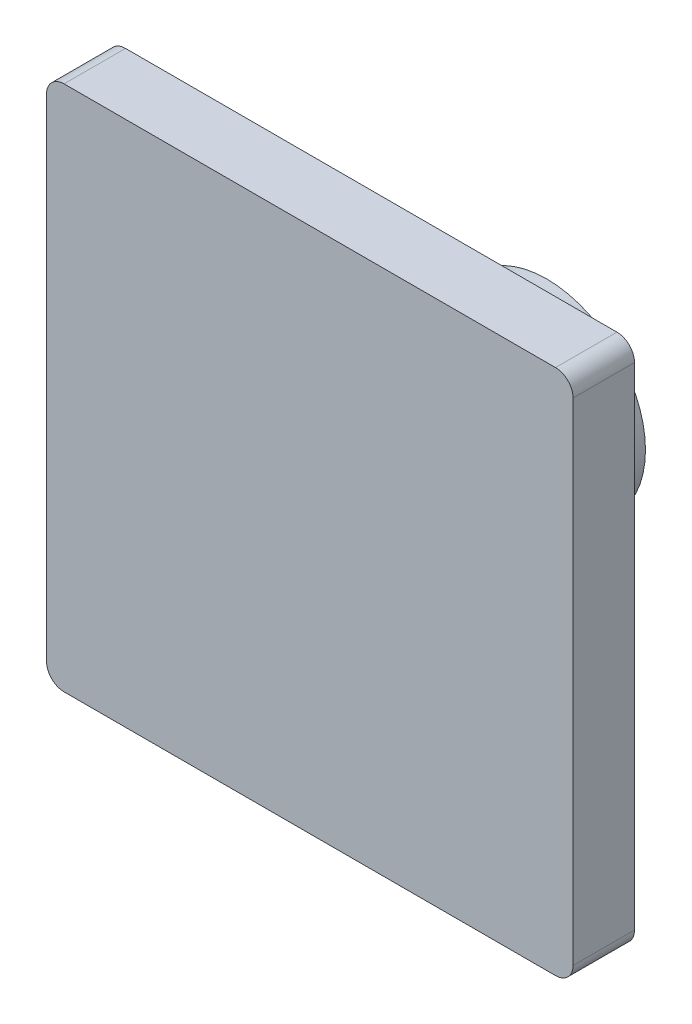
ISO-10303-21;
HEADER;
FILE_DESCRIPTION(('STEP AP214'),'2;1');
FILE_NAME('part.step','',(''),(''),'','','');
FILE_SCHEMA(('AUTOMOTIVE_DESIGN { 1 0 10303 214 1 1 1 1 }'));
ENDSEC;
DATA;
#1=APPLICATION_CONTEXT('core data for automotive mechanical design processes');
#2=APPLICATION_PROTOCOL_DEFINITION('international standard','automotive_design',2000,#1);
#3=PRODUCT_CONTEXT('',#1,'mechanical');
#4=PRODUCT('Part','Part','',(#3));
#5=PRODUCT_RELATED_PRODUCT_CATEGORY('part','',(#4));
#6=PRODUCT_DEFINITION_FORMATION('','',#4);
#7=PRODUCT_DEFINITION_CONTEXT('part definition',#1,'design');
#8=PRODUCT_DEFINITION('design','',#6,#7);
#9=PRODUCT_DEFINITION_SHAPE('','',#8);
#10=(LENGTH_UNIT() NAMED_UNIT(*) SI_UNIT(.MILLI.,.METRE.));
#11=(NAMED_UNIT(*) PLANE_ANGLE_UNIT() SI_UNIT($,.RADIAN.));
#12=(NAMED_UNIT(*) SI_UNIT($,.STERADIAN.) SOLID_ANGLE_UNIT());
#13=UNCERTAINTY_MEASURE_WITH_UNIT(LENGTH_MEASURE(1.E-05),#10,'distance_accuracy_value','');
#14=(GEOMETRIC_REPRESENTATION_CONTEXT(3) GLOBAL_UNCERTAINTY_ASSIGNED_CONTEXT((#13)) GLOBAL_UNIT_ASSIGNED_CONTEXT((#10,
#11,#12)) REPRESENTATION_CONTEXT('',''));
#15=CARTESIAN_POINT('',(0.,0.,0.));
#16=DIRECTION('',(0.,0.,1.));
#17=DIRECTION('',(1.,0.,0.));
#18=AXIS2_PLACEMENT_3D('',#15,#16,#17);
#19=CARTESIAN_POINT('',(-30.,-30.,0.));
#20=DIRECTION('',(0.,0.,1.));
#21=DIRECTION('',(1.,0.,0.));
#22=AXIS2_PLACEMENT_3D('',#19,#20,#21);
#23=PLANE('',#22);
#24=DIRECTION('',(1.,0.,0.));
#25=VECTOR('',#24,1.);
#26=CARTESIAN_POINT('',(-30.,-30.,0.));
#27=LINE('',#26,#25);
#28=CARTESIAN_POINT('',(-28.,-30.,0.));
#29=VERTEX_POINT('',#28);
#30=CARTESIAN_POINT('',(28.,-30.,0.));
#31=VERTEX_POINT('',#30);
#32=EDGE_CURVE('E116',#29,#31,#27,.T.);
#33=ORIENTED_EDGE('',*,*,#32,.F.);
#34=CARTESIAN_POINT('',(-28.,-28.,0.));
#35=DIRECTION('',(0.,0.,1.));
#36=DIRECTION('',(1.,0.,0.));
#37=AXIS2_PLACEMENT_3D('',#34,#35,#36);
#38=CIRCLE('',#37,2.);
#39=CARTESIAN_POINT('',(-30.,-28.,0.));
#40=VERTEX_POINT('',#39);
#41=EDGE_CURVE('E99',#29,#40,#38,.F.);
#42=ORIENTED_EDGE('',*,*,#41,.T.);
#43=DIRECTION('',(0.,-1.,0.));
#44=VECTOR('',#43,1.);
#45=CARTESIAN_POINT('',(-30.,30.,0.));
#46=LINE('',#45,#44);
#47=CARTESIAN_POINT('',(-30.,28.,0.));
#48=VERTEX_POINT('',#47);
#49=EDGE_CURVE('E126',#48,#40,#46,.T.);
#50=ORIENTED_EDGE('',*,*,#49,.F.);
#51=CARTESIAN_POINT('',(-28.,28.,0.));
#52=DIRECTION('',(0.,0.,1.));
#53=DIRECTION('',(1.,0.,0.));
#54=AXIS2_PLACEMENT_3D('',#51,#52,#53);
#55=CIRCLE('',#54,2.);
#56=CARTESIAN_POINT('',(-28.,30.,0.));
#57=VERTEX_POINT('',#56);
#58=EDGE_CURVE('E146',#48,#57,#55,.F.);
#59=ORIENTED_EDGE('',*,*,#58,.T.);
#60=DIRECTION('',(-1.,0.,0.));
#61=VECTOR('',#60,1.);
#62=CARTESIAN_POINT('',(-30.,30.,0.));
#63=LINE('',#62,#61);
#64=CARTESIAN_POINT('',(28.,30.,0.));
#65=VERTEX_POINT('',#64);
#66=EDGE_CURVE('E129',#65,#57,#63,.T.);
#67=ORIENTED_EDGE('',*,*,#66,.F.);
#68=CARTESIAN_POINT('',(28.,28.,0.));
#69=DIRECTION('',(0.,0.,1.));
#70=DIRECTION('',(1.,0.,0.));
#71=AXIS2_PLACEMENT_3D('',#68,#69,#70);
#72=CIRCLE('',#71,2.);
#73=CARTESIAN_POINT('',(30.,28.,0.));
#74=VERTEX_POINT('',#73);
#75=EDGE_CURVE('E120',#65,#74,#72,.F.);
#76=ORIENTED_EDGE('',*,*,#75,.T.);
#77=DIRECTION('',(0.,1.,0.));
#78=VECTOR('',#77,1.);
#79=CARTESIAN_POINT('',(30.,30.,0.));
#80=LINE('',#79,#78);
#81=CARTESIAN_POINT('',(30.,-28.,0.));
#82=VERTEX_POINT('',#81);
#83=EDGE_CURVE('E125',#82,#74,#80,.T.);
#84=ORIENTED_EDGE('',*,*,#83,.F.);
#85=CARTESIAN_POINT('',(28.,-28.,0.));
#86=DIRECTION('',(0.,0.,1.));
#87=DIRECTION('',(1.,0.,0.));
#88=AXIS2_PLACEMENT_3D('',#85,#86,#87);
#89=CIRCLE('',#88,2.);
#90=EDGE_CURVE('E110',#82,#31,#89,.F.);
#91=ORIENTED_EDGE('',*,*,#90,.T.);
#92=EDGE_LOOP('',(#33,#42,#50,#59,#67,#76,#84,#91));
#93=FACE_BOUND('',#92,.T.);
#94=CARTESIAN_POINT('',(0.,0.,0.));
#95=DIRECTION('',(0.,0.,1.));
#96=DIRECTION('',(1.,0.,0.));
#97=AXIS2_PLACEMENT_3D('',#94,#95,#96);
#98=CIRCLE('',#97,11.25);
#99=CARTESIAN_POINT('',(11.25,0.,0.));
#100=VERTEX_POINT('',#99);
#101=EDGE_CURVE('E11',#100,#100,#98,.F.);
#102=ORIENTED_EDGE('',*,*,#101,.F.);
#103=EDGE_LOOP('',(#102));
#104=FACE_BOUND('',#103,.T.);
#105=ADVANCED_FACE('F33',(#93,#104),#23,.F.);
#106=CARTESIAN_POINT('',(-30.,30.,7.));
#107=DIRECTION('',(1.,0.,0.));
#108=DIRECTION('',(0.,0.,-1.));
#109=AXIS2_PLACEMENT_3D('',#106,#107,#108);
#110=PLANE('',#109);
#111=ORIENTED_EDGE('',*,*,#49,.T.);
#112=DIRECTION('',(0.,0.,-1.));
#113=VECTOR('',#112,1.);
#114=CARTESIAN_POINT('',(-30.,-28.,7.));
#115=LINE('',#114,#113);
#116=CARTESIAN_POINT('',(-30.,-28.,7.));
#117=VERTEX_POINT('',#116);
#118=EDGE_CURVE('E104',#40,#117,#115,.F.);
#119=ORIENTED_EDGE('',*,*,#118,.T.);
#120=DIRECTION('',(0.,-1.,0.));
#121=VECTOR('',#120,1.);
#122=CARTESIAN_POINT('',(-30.,30.,7.));
#123=LINE('',#122,#121);
#124=CARTESIAN_POINT('',(-30.,28.,7.));
#125=VERTEX_POINT('',#124);
#126=EDGE_CURVE('E136',#125,#117,#123,.T.);
#127=ORIENTED_EDGE('',*,*,#126,.F.);
#128=DIRECTION('',(0.,0.,-1.));
#129=VECTOR('',#128,1.);
#130=CARTESIAN_POINT('',(-30.,28.,7.));
#131=LINE('',#130,#129);
#132=EDGE_CURVE('E109',#125,#48,#131,.T.);
#133=ORIENTED_EDGE('',*,*,#132,.T.);
#134=EDGE_LOOP('',(#111,#119,#127,#133));
#135=FACE_BOUND('',#134,.T.);
#136=ADVANCED_FACE('F35',(#135),#110,.F.);
#137=CARTESIAN_POINT('',(-30.,-30.,7.));
#138=DIRECTION('',(0.,1.,0.));
#139=DIRECTION('',(0.,0.,1.));
#140=AXIS2_PLACEMENT_3D('',#137,#138,#139);
#141=PLANE('',#140);
#142=DIRECTION('',(1.,0.,0.));
#143=VECTOR('',#142,1.);
#144=CARTESIAN_POINT('',(-30.,-30.,7.));
#145=LINE('',#144,#143);
#146=CARTESIAN_POINT('',(-28.,-30.,7.));
#147=VERTEX_POINT('',#146);
#148=CARTESIAN_POINT('',(28.,-30.,7.));
#149=VERTEX_POINT('',#148);
#150=EDGE_CURVE('E119',#147,#149,#145,.T.);
#151=ORIENTED_EDGE('',*,*,#150,.F.);
#152=DIRECTION('',(0.,0.,-1.));
#153=VECTOR('',#152,1.);
#154=CARTESIAN_POINT('',(-28.,-30.,7.));
#155=LINE('',#154,#153);
#156=EDGE_CURVE('E103',#147,#29,#155,.T.);
#157=ORIENTED_EDGE('',*,*,#156,.T.);
#158=ORIENTED_EDGE('',*,*,#32,.T.);
#159=DIRECTION('',(0.,0.,-1.));
#160=VECTOR('',#159,1.);
#161=CARTESIAN_POINT('',(28.,-30.,7.));
#162=LINE('',#161,#160);
#163=EDGE_CURVE('E121',#31,#149,#162,.F.);
#164=ORIENTED_EDGE('',*,*,#163,.T.);
#165=EDGE_LOOP('',(#151,#157,#158,#164));
#166=FACE_BOUND('',#165,.T.);
#167=ADVANCED_FACE('F115',(#166),#141,.F.);
#168=CARTESIAN_POINT('',(30.,30.,7.));
#169=DIRECTION('',(-1.,0.,0.));
#170=DIRECTION('',(0.,0.,1.));
#171=AXIS2_PLACEMENT_3D('',#168,#169,#170);
#172=PLANE('',#171);
#173=DIRECTION('',(0.,1.,0.));
#174=VECTOR('',#173,1.);
#175=CARTESIAN_POINT('',(30.,30.,7.));
#176=LINE('',#175,#174);
#177=CARTESIAN_POINT('',(30.,-28.,7.));
#178=VERTEX_POINT('',#177);
#179=CARTESIAN_POINT('',(30.,28.,7.));
#180=VERTEX_POINT('',#179);
#181=EDGE_CURVE('E140',#178,#180,#176,.T.);
#182=ORIENTED_EDGE('',*,*,#181,.F.);
#183=DIRECTION('',(0.,0.,-1.));
#184=VECTOR('',#183,1.);
#185=CARTESIAN_POINT('',(30.,-28.,7.));
#186=LINE('',#185,#184);
#187=EDGE_CURVE('E161',#178,#82,#186,.T.);
#188=ORIENTED_EDGE('',*,*,#187,.T.);
#189=ORIENTED_EDGE('',*,*,#83,.T.);
#190=DIRECTION('',(0.,0.,-1.));
#191=VECTOR('',#190,1.);
#192=CARTESIAN_POINT('',(30.,28.,7.));
#193=LINE('',#192,#191);
#194=EDGE_CURVE('E159',#74,#180,#193,.F.);
#195=ORIENTED_EDGE('',*,*,#194,.T.);
#196=EDGE_LOOP('',(#182,#188,#189,#195));
#197=FACE_BOUND('',#196,.T.);
#198=ADVANCED_FACE('F183',(#197),#172,.F.);
#199=CARTESIAN_POINT('',(-30.,30.,7.));
#200=DIRECTION('',(0.,-1.,0.));
#201=DIRECTION('',(0.,0.,-1.));
#202=AXIS2_PLACEMENT_3D('',#199,#200,#201);
#203=PLANE('',#202);
#204=ORIENTED_EDGE('',*,*,#66,.T.);
#205=DIRECTION('',(0.,0.,-1.));
#206=VECTOR('',#205,1.);
#207=CARTESIAN_POINT('',(-28.,30.,7.));
#208=LINE('',#207,#206);
#209=CARTESIAN_POINT('',(-28.,30.,7.));
#210=VERTEX_POINT('',#209);
#211=EDGE_CURVE('E41',#57,#210,#208,.F.);
#212=ORIENTED_EDGE('',*,*,#211,.T.);
#213=DIRECTION('',(-1.,0.,0.));
#214=VECTOR('',#213,1.);
#215=CARTESIAN_POINT('',(-30.,30.,7.));
#216=LINE('',#215,#214);
#217=CARTESIAN_POINT('',(28.,30.,7.));
#218=VERTEX_POINT('',#217);
#219=EDGE_CURVE('E142',#218,#210,#216,.T.);
#220=ORIENTED_EDGE('',*,*,#219,.F.);
#221=DIRECTION('',(0.,0.,-1.));
#222=VECTOR('',#221,1.);
#223=CARTESIAN_POINT('',(28.,30.,7.));
#224=LINE('',#223,#222);
#225=EDGE_CURVE('E164',#218,#65,#224,.T.);
#226=ORIENTED_EDGE('',*,*,#225,.T.);
#227=EDGE_LOOP('',(#204,#212,#220,#226));
#228=FACE_BOUND('',#227,.T.);
#229=ADVANCED_FACE('F168',(#228),#203,.F.);
#230=CARTESIAN_POINT('',(-30.,-30.,7.));
#231=DIRECTION('',(0.,0.,1.));
#232=DIRECTION('',(1.,0.,0.));
#233=AXIS2_PLACEMENT_3D('',#230,#231,#232);
#234=PLANE('',#233);
#235=ORIENTED_EDGE('',*,*,#126,.T.);
#236=CARTESIAN_POINT('',(-28.,-28.,7.));
#237=DIRECTION('',(0.,0.,1.));
#238=DIRECTION('',(1.,0.,0.));
#239=AXIS2_PLACEMENT_3D('',#236,#237,#238);
#240=CIRCLE('',#239,2.);
#241=EDGE_CURVE('E157',#117,#147,#240,.T.);
#242=ORIENTED_EDGE('',*,*,#241,.T.);
#243=ORIENTED_EDGE('',*,*,#150,.T.);
#244=CARTESIAN_POINT('',(28.,-28.,7.));
#245=DIRECTION('',(0.,0.,1.));
#246=DIRECTION('',(1.,0.,0.));
#247=AXIS2_PLACEMENT_3D('',#244,#245,#246);
#248=CIRCLE('',#247,2.);
#249=EDGE_CURVE('E155',#149,#178,#248,.T.);
#250=ORIENTED_EDGE('',*,*,#249,.T.);
#251=ORIENTED_EDGE('',*,*,#181,.T.);
#252=CARTESIAN_POINT('',(28.,28.,7.));
#253=DIRECTION('',(0.,0.,1.));
#254=DIRECTION('',(1.,0.,0.));
#255=AXIS2_PLACEMENT_3D('',#252,#253,#254);
#256=CIRCLE('',#255,2.);
#257=EDGE_CURVE('E54',#180,#218,#256,.T.);
#258=ORIENTED_EDGE('',*,*,#257,.T.);
#259=ORIENTED_EDGE('',*,*,#219,.T.);
#260=CARTESIAN_POINT('',(-28.,28.,7.));
#261=DIRECTION('',(0.,0.,1.));
#262=DIRECTION('',(1.,0.,0.));
#263=AXIS2_PLACEMENT_3D('',#260,#261,#262);
#264=CIRCLE('',#263,2.);
#265=EDGE_CURVE('E153',#210,#125,#264,.T.);
#266=ORIENTED_EDGE('',*,*,#265,.T.);
#267=EDGE_LOOP('',(#235,#242,#243,#250,#251,#258,#259,#266));
#268=FACE_BOUND('',#267,.T.);
#269=ADVANCED_FACE('F176',(#268),#234,.T.);
#270=CARTESIAN_POINT('',(-28.,-28.,7.));
#271=DIRECTION('',(0.,0.,-1.));
#272=DIRECTION('',(-1.,0.,0.));
#273=AXIS2_PLACEMENT_3D('',#270,#271,#272);
#274=CYLINDRICAL_SURFACE('',#273,2.);
#275=ORIENTED_EDGE('',*,*,#241,.F.);
#276=ORIENTED_EDGE('',*,*,#118,.F.);
#277=ORIENTED_EDGE('',*,*,#41,.F.);
#278=ORIENTED_EDGE('',*,*,#156,.F.);
#279=EDGE_LOOP('',(#275,#276,#277,#278));
#280=FACE_BOUND('',#279,.T.);
#281=ADVANCED_FACE('F102',(#280),#274,.T.);
#282=CARTESIAN_POINT('',(28.,-28.,7.));
#283=DIRECTION('',(0.,0.,-1.));
#284=DIRECTION('',(-1.,0.,0.));
#285=AXIS2_PLACEMENT_3D('',#282,#283,#284);
#286=CYLINDRICAL_SURFACE('',#285,2.);
#287=ORIENTED_EDGE('',*,*,#249,.F.);
#288=ORIENTED_EDGE('',*,*,#163,.F.);
#289=ORIENTED_EDGE('',*,*,#90,.F.);
#290=ORIENTED_EDGE('',*,*,#187,.F.);
#291=EDGE_LOOP('',(#287,#288,#289,#290));
#292=FACE_BOUND('',#291,.T.);
#293=ADVANCED_FACE('F181',(#292),#286,.T.);
#294=CARTESIAN_POINT('',(-28.,28.,7.));
#295=DIRECTION('',(0.,0.,-1.));
#296=DIRECTION('',(-1.,0.,0.));
#297=AXIS2_PLACEMENT_3D('',#294,#295,#296);
#298=CYLINDRICAL_SURFACE('',#297,2.);
#299=ORIENTED_EDGE('',*,*,#265,.F.);
#300=ORIENTED_EDGE('',*,*,#211,.F.);
#301=ORIENTED_EDGE('',*,*,#58,.F.);
#302=ORIENTED_EDGE('',*,*,#132,.F.);
#303=EDGE_LOOP('',(#299,#300,#301,#302));
#304=FACE_BOUND('',#303,.T.);
#305=ADVANCED_FACE('F173',(#304),#298,.T.);
#306=CARTESIAN_POINT('',(28.,28.,7.));
#307=DIRECTION('',(0.,0.,-1.));
#308=DIRECTION('',(-1.,0.,0.));
#309=AXIS2_PLACEMENT_3D('',#306,#307,#308);
#310=CYLINDRICAL_SURFACE('',#309,2.);
#311=ORIENTED_EDGE('',*,*,#257,.F.);
#312=ORIENTED_EDGE('',*,*,#194,.F.);
#313=ORIENTED_EDGE('',*,*,#75,.F.);
#314=ORIENTED_EDGE('',*,*,#225,.F.);
#315=EDGE_LOOP('',(#311,#312,#313,#314));
#316=FACE_BOUND('',#315,.T.);
#317=ADVANCED_FACE('F185',(#316),#310,.T.);
#318=CARTESIAN_POINT('',(0.,0.,-20.));
#319=DIRECTION('',(0.,0.,1.));
#320=DIRECTION('',(1.,0.,0.));
#321=AXIS2_PLACEMENT_3D('',#318,#319,#320);
#322=CYLINDRICAL_SURFACE('',#321,11.25);
#323=CARTESIAN_POINT('',(0.,0.,-20.));
#324=DIRECTION('',(0.,0.,-1.));
#325=DIRECTION('',(-1.,0.,0.));
#326=AXIS2_PLACEMENT_3D('',#323,#324,#325);
#327=CIRCLE('',#326,11.25);
#328=CARTESIAN_POINT('',(-11.25,0.,-20.));
#329=VERTEX_POINT('',#328);
#330=EDGE_CURVE('E131',#329,#329,#327,.T.);
#331=ORIENTED_EDGE('',*,*,#330,.F.);
#332=EDGE_LOOP('',(#331));
#333=FACE_BOUND('',#332,.T.);
#334=ORIENTED_EDGE('',*,*,#101,.T.);
#335=EDGE_LOOP('',(#334));
#336=FACE_BOUND('',#335,.T.);
#337=ADVANCED_FACE('F187',(#333,#336),#322,.T.);
#338=CARTESIAN_POINT('',(0.,0.,-20.));
#339=DIRECTION('',(0.,0.,-1.));
#340=DIRECTION('',(-1.,0.,0.));
#341=AXIS2_PLACEMENT_3D('',#338,#339,#340);
#342=PLANE('',#341);
#343=ORIENTED_EDGE('',*,*,#330,.T.);
#344=EDGE_LOOP('',(#343));
#345=FACE_BOUND('',#344,.T.);
#346=ADVANCED_FACE('F193',(#345),#342,.T.);
#347=CLOSED_SHELL('',(#105,#136,#167,#198,#229,#269,#281,#293,#305,#317,#337,#346));
#348=MANIFOLD_SOLID_BREP('B2',#347);
#349=ADVANCED_BREP_SHAPE_REPRESENTATION('',(#18,#348),#14);
#350=SHAPE_DEFINITION_REPRESENTATION(#9,#349);
ENDSEC;
END-ISO-10303-21;
